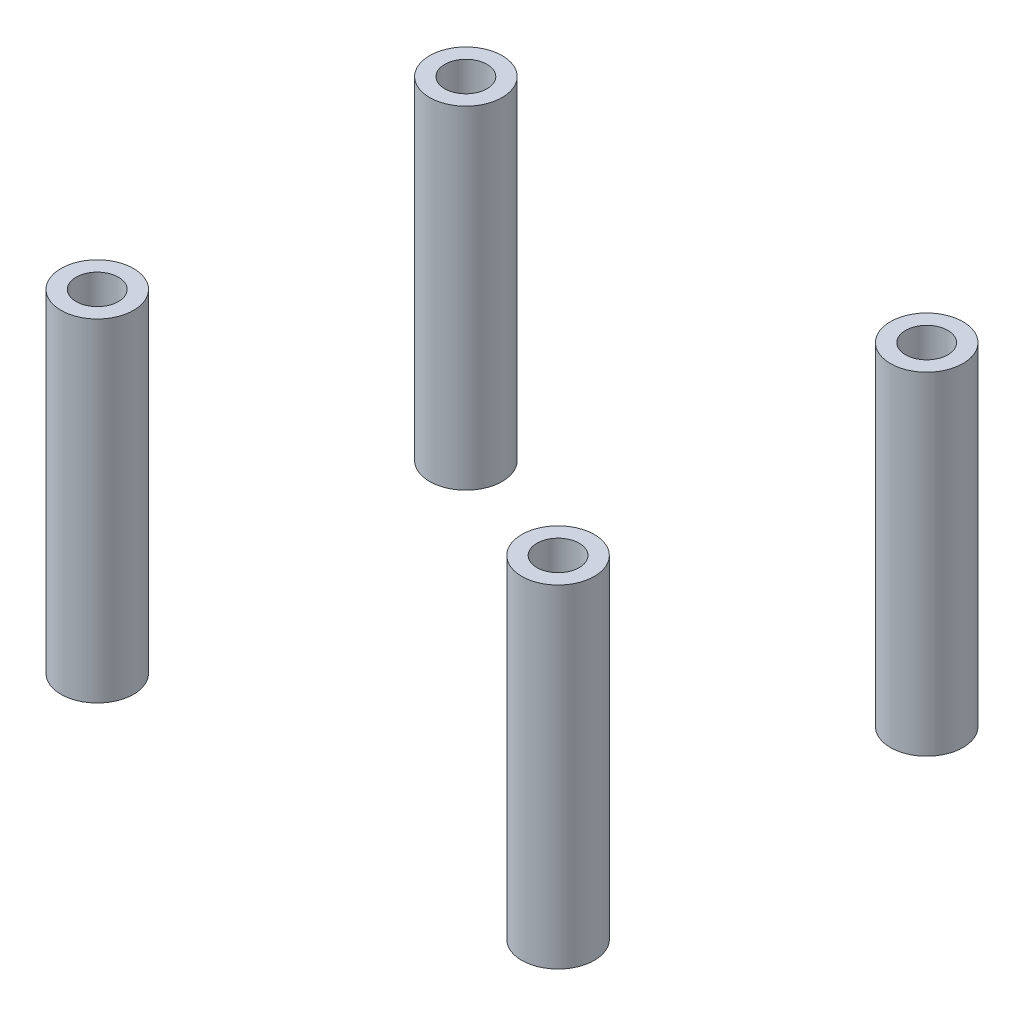
ISO-10303-21;
HEADER;
FILE_DESCRIPTION(('STEP AP214'),'2;1');
FILE_NAME('part.step','',(''),(''),'','','');
FILE_SCHEMA(('AUTOMOTIVE_DESIGN { 1 0 10303 214 1 1 1 1 }'));
ENDSEC;
DATA;
#1=APPLICATION_CONTEXT('core data for automotive mechanical design processes');
#2=APPLICATION_PROTOCOL_DEFINITION('international standard','automotive_design',2000,#1);
#3=PRODUCT_CONTEXT('',#1,'mechanical');
#4=PRODUCT('Part','Part','',(#3));
#5=PRODUCT_RELATED_PRODUCT_CATEGORY('part','',(#4));
#6=PRODUCT_DEFINITION_FORMATION('','',#4);
#7=PRODUCT_DEFINITION_CONTEXT('part definition',#1,'design');
#8=PRODUCT_DEFINITION('design','',#6,#7);
#9=PRODUCT_DEFINITION_SHAPE('','',#8);
#10=(LENGTH_UNIT() NAMED_UNIT(*) SI_UNIT(.MILLI.,.METRE.));
#11=(NAMED_UNIT(*) PLANE_ANGLE_UNIT() SI_UNIT($,.RADIAN.));
#12=(NAMED_UNIT(*) SI_UNIT($,.STERADIAN.) SOLID_ANGLE_UNIT());
#13=UNCERTAINTY_MEASURE_WITH_UNIT(LENGTH_MEASURE(1.E-05),#10,'distance_accuracy_value','');
#14=(GEOMETRIC_REPRESENTATION_CONTEXT(3) GLOBAL_UNCERTAINTY_ASSIGNED_CONTEXT((#13)) GLOBAL_UNIT_ASSIGNED_CONTEXT((#10,
#11,#12)) REPRESENTATION_CONTEXT('',''));
#15=CARTESIAN_POINT('',(0.,0.,0.));
#16=DIRECTION('',(0.,0.,1.));
#17=DIRECTION('',(1.,0.,0.));
#18=AXIS2_PLACEMENT_3D('',#15,#16,#17);
#19=CARTESIAN_POINT('',(-19.05,27.5,15.24));
#20=DIRECTION('',(0.,1.,0.));
#21=DIRECTION('',(0.,0.,1.));
#22=AXIS2_PLACEMENT_3D('',#19,#20,#21);
#23=PLANE('',#22);
#24=CARTESIAN_POINT('',(-19.05,27.5,15.24));
#25=DIRECTION('',(0.,1.,0.));
#26=DIRECTION('',(0.,0.,1.));
#27=AXIS2_PLACEMENT_3D('',#24,#25,#26);
#28=CIRCLE('',#27,3.);
#29=CARTESIAN_POINT('',(-19.05,27.5,18.24));
#30=VERTEX_POINT('',#29);
#31=EDGE_CURVE('E11',#30,#30,#28,.T.);
#32=ORIENTED_EDGE('',*,*,#31,.T.);
#33=EDGE_LOOP('',(#32));
#34=FACE_BOUND('',#33,.T.);
#35=CARTESIAN_POINT('',(-19.05,27.5,15.24));
#36=DIRECTION('',(0.,1.,0.));
#37=DIRECTION('',(0.,0.,1.));
#38=AXIS2_PLACEMENT_3D('',#35,#36,#37);
#39=CIRCLE('',#38,1.75);
#40=CARTESIAN_POINT('',(-19.05,27.5,16.99));
#41=VERTEX_POINT('',#40);
#42=EDGE_CURVE('E51',#41,#41,#39,.T.);
#43=ORIENTED_EDGE('',*,*,#42,.F.);
#44=EDGE_LOOP('',(#43));
#45=FACE_BOUND('',#44,.T.);
#46=ADVANCED_FACE('F40',(#34,#45),#23,.T.);
#47=CARTESIAN_POINT('',(-19.05,0.,15.24));
#48=DIRECTION('',(0.,1.,0.));
#49=DIRECTION('',(0.,0.,1.));
#50=AXIS2_PLACEMENT_3D('',#47,#48,#49);
#51=PLANE('',#50);
#52=CARTESIAN_POINT('',(-19.05,0.,15.24));
#53=DIRECTION('',(0.,1.,0.));
#54=DIRECTION('',(0.,0.,1.));
#55=AXIS2_PLACEMENT_3D('',#52,#53,#54);
#56=CIRCLE('',#55,3.);
#57=CARTESIAN_POINT('',(-19.05,0.,18.24));
#58=VERTEX_POINT('',#57);
#59=EDGE_CURVE('E44',#58,#58,#56,.T.);
#60=ORIENTED_EDGE('',*,*,#59,.F.);
#61=EDGE_LOOP('',(#60));
#62=FACE_BOUND('',#61,.T.);
#63=CARTESIAN_POINT('',(-19.05,0.,15.24));
#64=DIRECTION('',(0.,1.,0.));
#65=DIRECTION('',(0.,0.,1.));
#66=AXIS2_PLACEMENT_3D('',#63,#64,#65);
#67=CIRCLE('',#66,1.75);
#68=CARTESIAN_POINT('',(-19.05,0.,16.99));
#69=VERTEX_POINT('',#68);
#70=EDGE_CURVE('E53',#69,#69,#67,.T.);
#71=ORIENTED_EDGE('',*,*,#70,.T.);
#72=EDGE_LOOP('',(#71));
#73=FACE_BOUND('',#72,.T.);
#74=ADVANCED_FACE('F63',(#62,#73),#51,.F.);
#75=CARTESIAN_POINT('',(-19.05,27.5,15.24));
#76=DIRECTION('',(0.,-1.,0.));
#77=DIRECTION('',(0.,0.,-1.));
#78=AXIS2_PLACEMENT_3D('',#75,#76,#77);
#79=CYLINDRICAL_SURFACE('',#78,3.);
#80=ORIENTED_EDGE('',*,*,#31,.F.);
#81=EDGE_LOOP('',(#80));
#82=FACE_BOUND('',#81,.T.);
#83=ORIENTED_EDGE('',*,*,#59,.T.);
#84=EDGE_LOOP('',(#83));
#85=FACE_BOUND('',#84,.T.);
#86=ADVANCED_FACE('F42',(#82,#85),#79,.T.);
#87=CARTESIAN_POINT('',(-19.05,27.5,15.24));
#88=DIRECTION('',(0.,-1.,0.));
#89=DIRECTION('',(0.,0.,-1.));
#90=AXIS2_PLACEMENT_3D('',#87,#88,#89);
#91=CYLINDRICAL_SURFACE('',#90,1.75);
#92=ORIENTED_EDGE('',*,*,#42,.T.);
#93=EDGE_LOOP('',(#92));
#94=FACE_BOUND('',#93,.T.);
#95=ORIENTED_EDGE('',*,*,#70,.F.);
#96=EDGE_LOOP('',(#95));
#97=FACE_BOUND('',#96,.T.);
#98=ADVANCED_FACE('F59',(#94,#97),#91,.F.);
#99=CLOSED_SHELL('',(#46,#74,#86,#98));
#100=MANIFOLD_SOLID_BREP('B2',#99);
#101=CARTESIAN_POINT('',(19.05,27.5,15.24));
#102=DIRECTION('',(0.,1.,0.));
#103=DIRECTION('',(0.,0.,1.));
#104=AXIS2_PLACEMENT_3D('',#101,#102,#103);
#105=PLANE('',#104);
#106=CARTESIAN_POINT('',(19.05,27.5,15.24));
#107=DIRECTION('',(0.,1.,0.));
#108=DIRECTION('',(0.,0.,1.));
#109=AXIS2_PLACEMENT_3D('',#106,#107,#108);
#110=CIRCLE('',#109,3.);
#111=CARTESIAN_POINT('',(19.05,27.5,18.24));
#112=VERTEX_POINT('',#111);
#113=EDGE_CURVE('E39',#112,#112,#110,.T.);
#114=ORIENTED_EDGE('',*,*,#113,.T.);
#115=EDGE_LOOP('',(#114));
#116=FACE_BOUND('',#115,.T.);
#117=CARTESIAN_POINT('',(19.05,27.5,15.24));
#118=DIRECTION('',(0.,1.,0.));
#119=DIRECTION('',(0.,0.,1.));
#120=AXIS2_PLACEMENT_3D('',#117,#118,#119);
#121=CIRCLE('',#120,1.75);
#122=CARTESIAN_POINT('',(19.05,27.5,16.99));
#123=VERTEX_POINT('',#122);
#124=EDGE_CURVE('E121',#123,#123,#121,.T.);
#125=ORIENTED_EDGE('',*,*,#124,.F.);
#126=EDGE_LOOP('',(#125));
#127=FACE_BOUND('',#126,.T.);
#128=ADVANCED_FACE('F110',(#116,#127),#105,.T.);
#129=CARTESIAN_POINT('',(19.05,0.,15.24));
#130=DIRECTION('',(0.,1.,0.));
#131=DIRECTION('',(0.,0.,1.));
#132=AXIS2_PLACEMENT_3D('',#129,#130,#131);
#133=PLANE('',#132);
#134=CARTESIAN_POINT('',(19.05,0.,15.24));
#135=DIRECTION('',(0.,1.,0.));
#136=DIRECTION('',(0.,0.,1.));
#137=AXIS2_PLACEMENT_3D('',#134,#135,#136);
#138=CIRCLE('',#137,3.);
#139=CARTESIAN_POINT('',(19.05,0.,18.24));
#140=VERTEX_POINT('',#139);
#141=EDGE_CURVE('E114',#140,#140,#138,.T.);
#142=ORIENTED_EDGE('',*,*,#141,.F.);
#143=EDGE_LOOP('',(#142));
#144=FACE_BOUND('',#143,.T.);
#145=CARTESIAN_POINT('',(19.05,0.,15.24));
#146=DIRECTION('',(0.,1.,0.));
#147=DIRECTION('',(0.,0.,1.));
#148=AXIS2_PLACEMENT_3D('',#145,#146,#147);
#149=CIRCLE('',#148,1.75);
#150=CARTESIAN_POINT('',(19.05,0.,16.99));
#151=VERTEX_POINT('',#150);
#152=EDGE_CURVE('E123',#151,#151,#149,.T.);
#153=ORIENTED_EDGE('',*,*,#152,.T.);
#154=EDGE_LOOP('',(#153));
#155=FACE_BOUND('',#154,.T.);
#156=ADVANCED_FACE('F133',(#144,#155),#133,.F.);
#157=CARTESIAN_POINT('',(19.05,27.5,15.24));
#158=DIRECTION('',(0.,-1.,0.));
#159=DIRECTION('',(0.,0.,-1.));
#160=AXIS2_PLACEMENT_3D('',#157,#158,#159);
#161=CYLINDRICAL_SURFACE('',#160,3.);
#162=ORIENTED_EDGE('',*,*,#113,.F.);
#163=EDGE_LOOP('',(#162));
#164=FACE_BOUND('',#163,.T.);
#165=ORIENTED_EDGE('',*,*,#141,.T.);
#166=EDGE_LOOP('',(#165));
#167=FACE_BOUND('',#166,.T.);
#168=ADVANCED_FACE('F112',(#164,#167),#161,.T.);
#169=CARTESIAN_POINT('',(19.05,27.5,15.24));
#170=DIRECTION('',(0.,-1.,0.));
#171=DIRECTION('',(0.,0.,-1.));
#172=AXIS2_PLACEMENT_3D('',#169,#170,#171);
#173=CYLINDRICAL_SURFACE('',#172,1.75);
#174=ORIENTED_EDGE('',*,*,#124,.T.);
#175=EDGE_LOOP('',(#174));
#176=FACE_BOUND('',#175,.T.);
#177=ORIENTED_EDGE('',*,*,#152,.F.);
#178=EDGE_LOOP('',(#177));
#179=FACE_BOUND('',#178,.T.);
#180=ADVANCED_FACE('F129',(#176,#179),#173,.F.);
#181=CLOSED_SHELL('',(#128,#156,#168,#180));
#182=MANIFOLD_SOLID_BREP('B6',#181);
#183=CARTESIAN_POINT('',(19.05,27.5,-15.24));
#184=DIRECTION('',(0.,1.,0.));
#185=DIRECTION('',(0.,0.,1.));
#186=AXIS2_PLACEMENT_3D('',#183,#184,#185);
#187=PLANE('',#186);
#188=CARTESIAN_POINT('',(19.05,27.5,-15.24));
#189=DIRECTION('',(0.,1.,0.));
#190=DIRECTION('',(0.,0.,1.));
#191=AXIS2_PLACEMENT_3D('',#188,#189,#190);
#192=CIRCLE('',#191,3.);
#193=CARTESIAN_POINT('',(19.05,27.5,-12.24));
#194=VERTEX_POINT('',#193);
#195=EDGE_CURVE('E109',#194,#194,#192,.T.);
#196=ORIENTED_EDGE('',*,*,#195,.T.);
#197=EDGE_LOOP('',(#196));
#198=FACE_BOUND('',#197,.T.);
#199=CARTESIAN_POINT('',(19.05,27.5,-15.24));
#200=DIRECTION('',(0.,1.,0.));
#201=DIRECTION('',(0.,0.,1.));
#202=AXIS2_PLACEMENT_3D('',#199,#200,#201);
#203=CIRCLE('',#202,1.75);
#204=CARTESIAN_POINT('',(19.05,27.5,-13.49));
#205=VERTEX_POINT('',#204);
#206=EDGE_CURVE('E190',#205,#205,#203,.T.);
#207=ORIENTED_EDGE('',*,*,#206,.F.);
#208=EDGE_LOOP('',(#207));
#209=FACE_BOUND('',#208,.T.);
#210=ADVANCED_FACE('F179',(#198,#209),#187,.T.);
#211=CARTESIAN_POINT('',(19.05,0.,-15.24));
#212=DIRECTION('',(0.,1.,0.));
#213=DIRECTION('',(0.,0.,1.));
#214=AXIS2_PLACEMENT_3D('',#211,#212,#213);
#215=PLANE('',#214);
#216=CARTESIAN_POINT('',(19.05,0.,-15.24));
#217=DIRECTION('',(0.,1.,0.));
#218=DIRECTION('',(0.,0.,1.));
#219=AXIS2_PLACEMENT_3D('',#216,#217,#218);
#220=CIRCLE('',#219,3.);
#221=CARTESIAN_POINT('',(19.05,0.,-12.24));
#222=VERTEX_POINT('',#221);
#223=EDGE_CURVE('E183',#222,#222,#220,.T.);
#224=ORIENTED_EDGE('',*,*,#223,.F.);
#225=EDGE_LOOP('',(#224));
#226=FACE_BOUND('',#225,.T.);
#227=CARTESIAN_POINT('',(19.05,0.,-15.24));
#228=DIRECTION('',(0.,1.,0.));
#229=DIRECTION('',(0.,0.,1.));
#230=AXIS2_PLACEMENT_3D('',#227,#228,#229);
#231=CIRCLE('',#230,1.75);
#232=CARTESIAN_POINT('',(19.05,0.,-13.49));
#233=VERTEX_POINT('',#232);
#234=EDGE_CURVE('E192',#233,#233,#231,.T.);
#235=ORIENTED_EDGE('',*,*,#234,.T.);
#236=EDGE_LOOP('',(#235));
#237=FACE_BOUND('',#236,.T.);
#238=ADVANCED_FACE('F202',(#226,#237),#215,.F.);
#239=CARTESIAN_POINT('',(19.05,27.5,-15.24));
#240=DIRECTION('',(0.,-1.,0.));
#241=DIRECTION('',(0.,0.,-1.));
#242=AXIS2_PLACEMENT_3D('',#239,#240,#241);
#243=CYLINDRICAL_SURFACE('',#242,3.);
#244=ORIENTED_EDGE('',*,*,#195,.F.);
#245=EDGE_LOOP('',(#244));
#246=FACE_BOUND('',#245,.T.);
#247=ORIENTED_EDGE('',*,*,#223,.T.);
#248=EDGE_LOOP('',(#247));
#249=FACE_BOUND('',#248,.T.);
#250=ADVANCED_FACE('F181',(#246,#249),#243,.T.);
#251=CARTESIAN_POINT('',(19.05,27.5,-15.24));
#252=DIRECTION('',(0.,-1.,0.));
#253=DIRECTION('',(0.,0.,-1.));
#254=AXIS2_PLACEMENT_3D('',#251,#252,#253);
#255=CYLINDRICAL_SURFACE('',#254,1.75);
#256=ORIENTED_EDGE('',*,*,#206,.T.);
#257=EDGE_LOOP('',(#256));
#258=FACE_BOUND('',#257,.T.);
#259=ORIENTED_EDGE('',*,*,#234,.F.);
#260=EDGE_LOOP('',(#259));
#261=FACE_BOUND('',#260,.T.);
#262=ADVANCED_FACE('F198',(#258,#261),#255,.F.);
#263=CLOSED_SHELL('',(#210,#238,#250,#262));
#264=MANIFOLD_SOLID_BREP('B34',#263);
#265=CARTESIAN_POINT('',(-19.05,27.5,-15.24));
#266=DIRECTION('',(0.,1.,0.));
#267=DIRECTION('',(0.,0.,1.));
#268=AXIS2_PLACEMENT_3D('',#265,#266,#267);
#269=PLANE('',#268);
#270=CARTESIAN_POINT('',(-19.05,27.5,-15.24));
#271=DIRECTION('',(0.,1.,0.));
#272=DIRECTION('',(0.,0.,1.));
#273=AXIS2_PLACEMENT_3D('',#270,#271,#272);
#274=CIRCLE('',#273,3.);
#275=CARTESIAN_POINT('',(-19.05,27.5,-12.24));
#276=VERTEX_POINT('',#275);
#277=EDGE_CURVE('E178',#276,#276,#274,.T.);
#278=ORIENTED_EDGE('',*,*,#277,.T.);
#279=EDGE_LOOP('',(#278));
#280=FACE_BOUND('',#279,.T.);
#281=CARTESIAN_POINT('',(-19.05,27.5,-15.24));
#282=DIRECTION('',(0.,1.,0.));
#283=DIRECTION('',(0.,0.,1.));
#284=AXIS2_PLACEMENT_3D('',#281,#282,#283);
#285=CIRCLE('',#284,1.75);
#286=CARTESIAN_POINT('',(-19.05,27.5,-13.49));
#287=VERTEX_POINT('',#286);
#288=EDGE_CURVE('E252',#287,#287,#285,.T.);
#289=ORIENTED_EDGE('',*,*,#288,.F.);
#290=EDGE_LOOP('',(#289));
#291=FACE_BOUND('',#290,.T.);
#292=ADVANCED_FACE('F241',(#280,#291),#269,.T.);
#293=CARTESIAN_POINT('',(-19.05,0.,-15.24));
#294=DIRECTION('',(0.,1.,0.));
#295=DIRECTION('',(0.,0.,1.));
#296=AXIS2_PLACEMENT_3D('',#293,#294,#295);
#297=PLANE('',#296);
#298=CARTESIAN_POINT('',(-19.05,0.,-15.24));
#299=DIRECTION('',(0.,1.,0.));
#300=DIRECTION('',(0.,0.,1.));
#301=AXIS2_PLACEMENT_3D('',#298,#299,#300);
#302=CIRCLE('',#301,3.);
#303=CARTESIAN_POINT('',(-19.05,0.,-12.24));
#304=VERTEX_POINT('',#303);
#305=EDGE_CURVE('E245',#304,#304,#302,.T.);
#306=ORIENTED_EDGE('',*,*,#305,.F.);
#307=EDGE_LOOP('',(#306));
#308=FACE_BOUND('',#307,.T.);
#309=CARTESIAN_POINT('',(-19.05,0.,-15.24));
#310=DIRECTION('',(0.,1.,0.));
#311=DIRECTION('',(0.,0.,1.));
#312=AXIS2_PLACEMENT_3D('',#309,#310,#311);
#313=CIRCLE('',#312,1.75);
#314=CARTESIAN_POINT('',(-19.05,0.,-13.49));
#315=VERTEX_POINT('',#314);
#316=EDGE_CURVE('E254',#315,#315,#313,.T.);
#317=ORIENTED_EDGE('',*,*,#316,.T.);
#318=EDGE_LOOP('',(#317));
#319=FACE_BOUND('',#318,.T.);
#320=ADVANCED_FACE('F264',(#308,#319),#297,.F.);
#321=CARTESIAN_POINT('',(-19.05,27.5,-15.24));
#322=DIRECTION('',(0.,-1.,0.));
#323=DIRECTION('',(0.,0.,-1.));
#324=AXIS2_PLACEMENT_3D('',#321,#322,#323);
#325=CYLINDRICAL_SURFACE('',#324,3.);
#326=ORIENTED_EDGE('',*,*,#277,.F.);
#327=EDGE_LOOP('',(#326));
#328=FACE_BOUND('',#327,.T.);
#329=ORIENTED_EDGE('',*,*,#305,.T.);
#330=EDGE_LOOP('',(#329));
#331=FACE_BOUND('',#330,.T.);
#332=ADVANCED_FACE('F243',(#328,#331),#325,.T.);
#333=CARTESIAN_POINT('',(-19.05,27.5,-15.24));
#334=DIRECTION('',(0.,-1.,0.));
#335=DIRECTION('',(0.,0.,-1.));
#336=AXIS2_PLACEMENT_3D('',#333,#334,#335);
#337=CYLINDRICAL_SURFACE('',#336,1.75);
#338=ORIENTED_EDGE('',*,*,#288,.T.);
#339=EDGE_LOOP('',(#338));
#340=FACE_BOUND('',#339,.T.);
#341=ORIENTED_EDGE('',*,*,#316,.F.);
#342=EDGE_LOOP('',(#341));
#343=FACE_BOUND('',#342,.T.);
#344=ADVANCED_FACE('F260',(#340,#343),#337,.F.);
#345=CLOSED_SHELL('',(#292,#320,#332,#344));
#346=MANIFOLD_SOLID_BREP('B104',#345);
#347=ADVANCED_BREP_SHAPE_REPRESENTATION('',(#18,#100,#182,#264,#346),#14);
#348=SHAPE_DEFINITION_REPRESENTATION(#9,#347);
ENDSEC;
END-ISO-10303-21;
